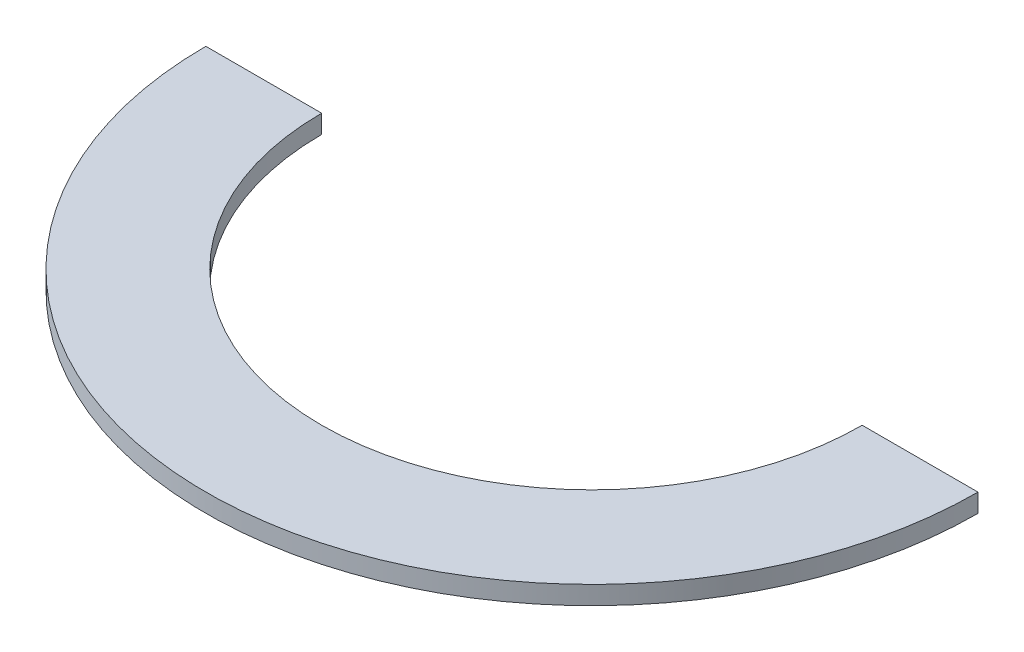
ISO-10303-21;
HEADER;
FILE_DESCRIPTION(('STEP AP214'),'2;1');
FILE_NAME('part.step','',(''),(''),'','','');
FILE_SCHEMA(('AUTOMOTIVE_DESIGN { 1 0 10303 214 1 1 1 1 }'));
ENDSEC;
DATA;
#1=APPLICATION_CONTEXT('core data for automotive mechanical design processes');
#2=APPLICATION_PROTOCOL_DEFINITION('international standard','automotive_design',2000,#1);
#3=PRODUCT_CONTEXT('',#1,'mechanical');
#4=PRODUCT('Part','Part','',(#3));
#5=PRODUCT_RELATED_PRODUCT_CATEGORY('part','',(#4));
#6=PRODUCT_DEFINITION_FORMATION('','',#4);
#7=PRODUCT_DEFINITION_CONTEXT('part definition',#1,'design');
#8=PRODUCT_DEFINITION('design','',#6,#7);
#9=PRODUCT_DEFINITION_SHAPE('','',#8);
#10=(LENGTH_UNIT() NAMED_UNIT(*) SI_UNIT(.MILLI.,.METRE.));
#11=(NAMED_UNIT(*) PLANE_ANGLE_UNIT() SI_UNIT($,.RADIAN.));
#12=(NAMED_UNIT(*) SI_UNIT($,.STERADIAN.) SOLID_ANGLE_UNIT());
#13=UNCERTAINTY_MEASURE_WITH_UNIT(LENGTH_MEASURE(1.E-05),#10,'distance_accuracy_value','');
#14=(GEOMETRIC_REPRESENTATION_CONTEXT(3) GLOBAL_UNCERTAINTY_ASSIGNED_CONTEXT((#13)) GLOBAL_UNIT_ASSIGNED_CONTEXT((#10,
#11,#12)) REPRESENTATION_CONTEXT('',''));
#15=CARTESIAN_POINT('',(0.,0.,0.));
#16=DIRECTION('',(0.,0.,1.));
#17=DIRECTION('',(1.,0.,0.));
#18=AXIS2_PLACEMENT_3D('',#15,#16,#17);
#19=CARTESIAN_POINT('',(0.,2.3875,0.));
#20=DIRECTION('',(0.,-1.,0.));
#21=DIRECTION('',(0.,0.,-1.));
#22=AXIS2_PLACEMENT_3D('',#19,#20,#21);
#23=CYLINDRICAL_SURFACE('',#22,50.);
#24=CARTESIAN_POINT('',(0.,0.,0.));
#25=DIRECTION('',(0.,1.,0.));
#26=DIRECTION('',(0.,0.,1.));
#27=AXIS2_PLACEMENT_3D('',#24,#25,#26);
#28=CIRCLE('',#27,50.);
#29=CARTESIAN_POINT('',(-50.,0.,0.));
#30=VERTEX_POINT('',#29);
#31=CARTESIAN_POINT('',(50.,0.,0.));
#32=VERTEX_POINT('',#31);
#33=EDGE_CURVE('E98',#30,#32,#28,.T.);
#34=ORIENTED_EDGE('',*,*,#33,.T.);
#35=DIRECTION('',(0.,-1.,0.));
#36=VECTOR('',#35,1.);
#37=CARTESIAN_POINT('',(50.,2.3875,0.));
#38=LINE('',#37,#36);
#39=CARTESIAN_POINT('',(50.,2.3875,0.));
#40=VERTEX_POINT('',#39);
#41=EDGE_CURVE('E11',#40,#32,#38,.T.);
#42=ORIENTED_EDGE('',*,*,#41,.F.);
#43=CARTESIAN_POINT('',(0.,2.3875,0.));
#44=DIRECTION('',(0.,1.,0.));
#45=DIRECTION('',(0.,0.,1.));
#46=AXIS2_PLACEMENT_3D('',#43,#44,#45);
#47=CIRCLE('',#46,50.);
#48=CARTESIAN_POINT('',(-50.,2.3875,0.));
#49=VERTEX_POINT('',#48);
#50=EDGE_CURVE('E86',#49,#40,#47,.T.);
#51=ORIENTED_EDGE('',*,*,#50,.F.);
#52=DIRECTION('',(0.,-1.,0.));
#53=VECTOR('',#52,1.);
#54=CARTESIAN_POINT('',(-50.,2.3875,0.));
#55=LINE('',#54,#53);
#56=EDGE_CURVE('E94',#49,#30,#55,.T.);
#57=ORIENTED_EDGE('',*,*,#56,.T.);
#58=EDGE_LOOP('',(#34,#42,#51,#57));
#59=FACE_BOUND('',#58,.T.);
#60=ADVANCED_FACE('F35',(#59),#23,.T.);
#61=CARTESIAN_POINT('',(35.,2.3875,0.));
#62=DIRECTION('',(0.,0.,1.));
#63=DIRECTION('',(1.,0.,0.));
#64=AXIS2_PLACEMENT_3D('',#61,#62,#63);
#65=PLANE('',#64);
#66=DIRECTION('',(-1.,0.,0.));
#67=VECTOR('',#66,1.);
#68=CARTESIAN_POINT('',(35.,0.,0.));
#69=LINE('',#68,#67);
#70=CARTESIAN_POINT('',(35.,0.,0.));
#71=VERTEX_POINT('',#70);
#72=EDGE_CURVE('E90',#32,#71,#69,.T.);
#73=ORIENTED_EDGE('',*,*,#72,.T.);
#74=DIRECTION('',(0.,-1.,0.));
#75=VECTOR('',#74,1.);
#76=CARTESIAN_POINT('',(35.,2.3875,0.));
#77=LINE('',#76,#75);
#78=CARTESIAN_POINT('',(35.,2.3875,0.));
#79=VERTEX_POINT('',#78);
#80=EDGE_CURVE('E43',#79,#71,#77,.T.);
#81=ORIENTED_EDGE('',*,*,#80,.F.);
#82=DIRECTION('',(-1.,0.,0.));
#83=VECTOR('',#82,1.);
#84=CARTESIAN_POINT('',(35.,2.3875,0.));
#85=LINE('',#84,#83);
#86=EDGE_CURVE('E81',#40,#79,#85,.T.);
#87=ORIENTED_EDGE('',*,*,#86,.F.);
#88=ORIENTED_EDGE('',*,*,#41,.T.);
#89=EDGE_LOOP('',(#73,#81,#87,#88));
#90=FACE_BOUND('',#89,.T.);
#91=ADVANCED_FACE('F89',(#90),#65,.F.);
#92=CARTESIAN_POINT('',(0.,2.3875,0.));
#93=DIRECTION('',(0.,-1.,0.));
#94=DIRECTION('',(0.,0.,-1.));
#95=AXIS2_PLACEMENT_3D('',#92,#93,#94);
#96=CYLINDRICAL_SURFACE('',#95,35.);
#97=CARTESIAN_POINT('',(0.,0.,0.));
#98=DIRECTION('',(0.,-1.,0.));
#99=DIRECTION('',(0.,0.,1.));
#100=AXIS2_PLACEMENT_3D('',#97,#98,#99);
#101=CIRCLE('',#100,35.);
#102=CARTESIAN_POINT('',(-35.,0.,0.));
#103=VERTEX_POINT('',#102);
#104=EDGE_CURVE('E68',#71,#103,#101,.T.);
#105=ORIENTED_EDGE('',*,*,#104,.T.);
#106=DIRECTION('',(0.,-1.,0.));
#107=VECTOR('',#106,1.);
#108=CARTESIAN_POINT('',(-35.,2.3875,0.));
#109=LINE('',#108,#107);
#110=CARTESIAN_POINT('',(-35.,2.3875,0.));
#111=VERTEX_POINT('',#110);
#112=EDGE_CURVE('E91',#111,#103,#109,.T.);
#113=ORIENTED_EDGE('',*,*,#112,.F.);
#114=CARTESIAN_POINT('',(0.,2.3875,0.));
#115=DIRECTION('',(0.,-1.,0.));
#116=DIRECTION('',(0.,0.,1.));
#117=AXIS2_PLACEMENT_3D('',#114,#115,#116);
#118=CIRCLE('',#117,35.);
#119=EDGE_CURVE('E84',#79,#111,#118,.T.);
#120=ORIENTED_EDGE('',*,*,#119,.F.);
#121=ORIENTED_EDGE('',*,*,#80,.T.);
#122=EDGE_LOOP('',(#105,#113,#120,#121));
#123=FACE_BOUND('',#122,.T.);
#124=ADVANCED_FACE('F92',(#123),#96,.F.);
#125=CARTESIAN_POINT('',(-50.,2.3875,0.));
#126=DIRECTION('',(0.,0.,1.));
#127=DIRECTION('',(1.,0.,0.));
#128=AXIS2_PLACEMENT_3D('',#125,#126,#127);
#129=PLANE('',#128);
#130=DIRECTION('',(-1.,0.,0.));
#131=VECTOR('',#130,1.);
#132=CARTESIAN_POINT('',(-50.,0.,0.));
#133=LINE('',#132,#131);
#134=EDGE_CURVE('E74',#103,#30,#133,.T.);
#135=ORIENTED_EDGE('',*,*,#134,.T.);
#136=ORIENTED_EDGE('',*,*,#56,.F.);
#137=DIRECTION('',(-1.,0.,0.));
#138=VECTOR('',#137,1.);
#139=CARTESIAN_POINT('',(-50.,2.3875,0.));
#140=LINE('',#139,#138);
#141=EDGE_CURVE('E51',#111,#49,#140,.T.);
#142=ORIENTED_EDGE('',*,*,#141,.F.);
#143=ORIENTED_EDGE('',*,*,#112,.T.);
#144=EDGE_LOOP('',(#135,#136,#142,#143));
#145=FACE_BOUND('',#144,.T.);
#146=ADVANCED_FACE('F105',(#145),#129,.F.);
#147=CARTESIAN_POINT('',(0.,2.3875,0.));
#148=DIRECTION('',(0.,1.,0.));
#149=DIRECTION('',(0.,0.,1.));
#150=AXIS2_PLACEMENT_3D('',#147,#148,#149);
#151=PLANE('',#150);
#152=ORIENTED_EDGE('',*,*,#50,.T.);
#153=ORIENTED_EDGE('',*,*,#86,.T.);
#154=ORIENTED_EDGE('',*,*,#119,.T.);
#155=ORIENTED_EDGE('',*,*,#141,.T.);
#156=EDGE_LOOP('',(#152,#153,#154,#155));
#157=FACE_BOUND('',#156,.T.);
#158=ADVANCED_FACE('F82',(#157),#151,.T.);
#159=CARTESIAN_POINT('',(0.,0.,0.));
#160=DIRECTION('',(0.,1.,0.));
#161=DIRECTION('',(0.,0.,1.));
#162=AXIS2_PLACEMENT_3D('',#159,#160,#161);
#163=PLANE('',#162);
#164=ORIENTED_EDGE('',*,*,#33,.F.);
#165=ORIENTED_EDGE('',*,*,#134,.F.);
#166=ORIENTED_EDGE('',*,*,#104,.F.);
#167=ORIENTED_EDGE('',*,*,#72,.F.);
#168=EDGE_LOOP('',(#164,#165,#166,#167));
#169=FACE_BOUND('',#168,.T.);
#170=ADVANCED_FACE('F108',(#169),#163,.F.);
#171=CLOSED_SHELL('',(#60,#91,#124,#146,#158,#170));
#172=MANIFOLD_SOLID_BREP('B2',#171);
#173=ADVANCED_BREP_SHAPE_REPRESENTATION('',(#18,#172),#14);
#174=SHAPE_DEFINITION_REPRESENTATION(#9,#173);
ENDSEC;
END-ISO-10303-21;
